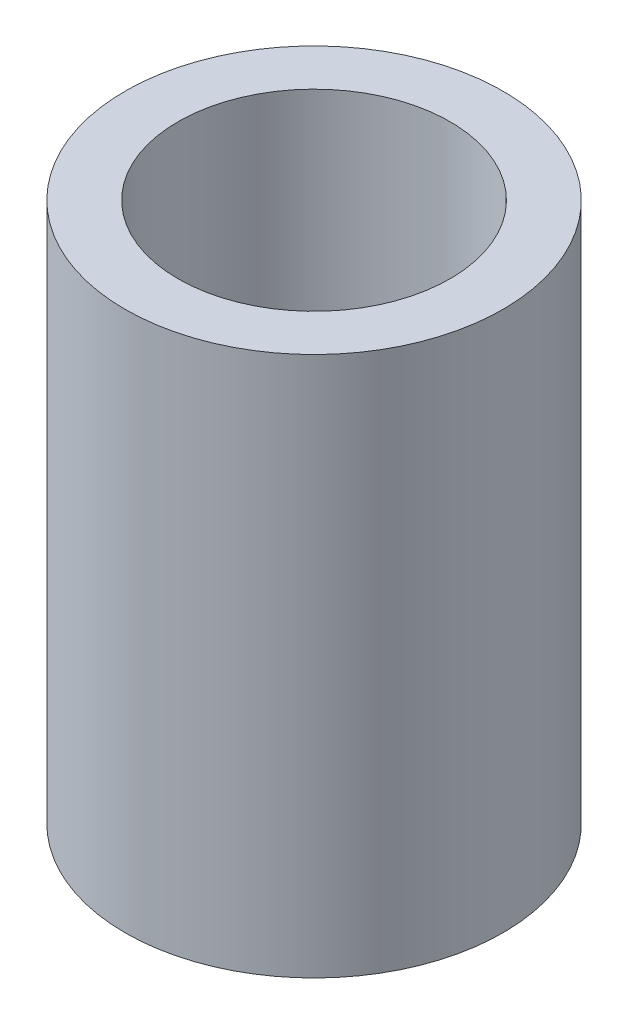
ISO-10303-21;
HEADER;
FILE_DESCRIPTION(('STEP AP214'),'2;1');
FILE_NAME('part.step','',(''),(''),'','','');
FILE_SCHEMA(('AUTOMOTIVE_DESIGN { 1 0 10303 214 1 1 1 1 }'));
ENDSEC;
DATA;
#1=APPLICATION_CONTEXT('core data for automotive mechanical design processes');
#2=APPLICATION_PROTOCOL_DEFINITION('international standard','automotive_design',2000,#1);
#3=PRODUCT_CONTEXT('',#1,'mechanical');
#4=PRODUCT('Part','Part','',(#3));
#5=PRODUCT_RELATED_PRODUCT_CATEGORY('part','',(#4));
#6=PRODUCT_DEFINITION_FORMATION('','',#4);
#7=PRODUCT_DEFINITION_CONTEXT('part definition',#1,'design');
#8=PRODUCT_DEFINITION('design','',#6,#7);
#9=PRODUCT_DEFINITION_SHAPE('','',#8);
#10=(LENGTH_UNIT() NAMED_UNIT(*) SI_UNIT(.MILLI.,.METRE.));
#11=(NAMED_UNIT(*) PLANE_ANGLE_UNIT() SI_UNIT($,.RADIAN.));
#12=(NAMED_UNIT(*) SI_UNIT($,.STERADIAN.) SOLID_ANGLE_UNIT());
#13=UNCERTAINTY_MEASURE_WITH_UNIT(LENGTH_MEASURE(1.E-05),#10,'distance_accuracy_value','');
#14=(GEOMETRIC_REPRESENTATION_CONTEXT(3) GLOBAL_UNCERTAINTY_ASSIGNED_CONTEXT((#13)) GLOBAL_UNIT_ASSIGNED_CONTEXT((#10,
#11,#12)) REPRESENTATION_CONTEXT('',''));
#15=CARTESIAN_POINT('',(0.,0.,0.));
#16=DIRECTION('',(0.,0.,1.));
#17=DIRECTION('',(1.,0.,0.));
#18=AXIS2_PLACEMENT_3D('',#15,#16,#17);
#19=CARTESIAN_POINT('',(0.,6.35,0.));
#20=DIRECTION('',(0.,1.,0.));
#21=DIRECTION('',(0.,0.,1.));
#22=AXIS2_PLACEMENT_3D('',#19,#20,#21);
#23=PLANE('',#22);
#24=CARTESIAN_POINT('',(0.,6.35,0.));
#25=DIRECTION('',(0.,1.,0.));
#26=DIRECTION('',(0.,0.,1.));
#27=AXIS2_PLACEMENT_3D('',#24,#25,#26);
#28=CIRCLE('',#27,4.445);
#29=CARTESIAN_POINT('',(0.,6.35,4.445));
#30=VERTEX_POINT('',#29);
#31=EDGE_CURVE('E10',#30,#30,#28,.T.);
#32=ORIENTED_EDGE('',*,*,#31,.T.);
#33=EDGE_LOOP('',(#32));
#34=FACE_BOUND('',#33,.T.);
#35=CARTESIAN_POINT('',(0.,6.35,0.));
#36=DIRECTION('',(0.,1.,0.));
#37=DIRECTION('',(0.,0.,1.));
#38=AXIS2_PLACEMENT_3D('',#35,#36,#37);
#39=CIRCLE('',#38,3.2004);
#40=CARTESIAN_POINT('',(0.,6.35,3.2004));
#41=VERTEX_POINT('',#40);
#42=EDGE_CURVE('E58',#41,#41,#39,.T.);
#43=ORIENTED_EDGE('',*,*,#42,.F.);
#44=EDGE_LOOP('',(#43));
#45=FACE_BOUND('',#44,.T.);
#46=ADVANCED_FACE('F45',(#34,#45),#23,.T.);
#47=CARTESIAN_POINT('',(0.,-6.35,0.));
#48=DIRECTION('',(0.,1.,0.));
#49=DIRECTION('',(0.,0.,1.));
#50=AXIS2_PLACEMENT_3D('',#47,#48,#49);
#51=PLANE('',#50);
#52=CARTESIAN_POINT('',(0.,-6.35,0.));
#53=DIRECTION('',(0.,1.,0.));
#54=DIRECTION('',(0.,0.,1.));
#55=AXIS2_PLACEMENT_3D('',#52,#53,#54);
#56=CIRCLE('',#55,4.445);
#57=CARTESIAN_POINT('',(0.,-6.35,4.445));
#58=VERTEX_POINT('',#57);
#59=EDGE_CURVE('E49',#58,#58,#56,.T.);
#60=ORIENTED_EDGE('',*,*,#59,.F.);
#61=EDGE_LOOP('',(#60));
#62=FACE_BOUND('',#61,.T.);
#63=CARTESIAN_POINT('',(0.,-6.35,0.));
#64=DIRECTION('',(0.,1.,0.));
#65=DIRECTION('',(0.,0.,1.));
#66=AXIS2_PLACEMENT_3D('',#63,#64,#65);
#67=CIRCLE('',#66,3.2004);
#68=CARTESIAN_POINT('',(0.,-6.35,3.2004));
#69=VERTEX_POINT('',#68);
#70=EDGE_CURVE('E60',#69,#69,#67,.T.);
#71=ORIENTED_EDGE('',*,*,#70,.T.);
#72=EDGE_LOOP('',(#71));
#73=FACE_BOUND('',#72,.T.);
#74=ADVANCED_FACE('F72',(#62,#73),#51,.F.);
#75=CARTESIAN_POINT('',(0.,6.35,0.));
#76=DIRECTION('',(0.,-1.,0.));
#77=DIRECTION('',(0.,0.,-1.));
#78=AXIS2_PLACEMENT_3D('',#75,#76,#77);
#79=CYLINDRICAL_SURFACE('',#78,4.445);
#80=ORIENTED_EDGE('',*,*,#31,.F.);
#81=EDGE_LOOP('',(#80));
#82=FACE_BOUND('',#81,.T.);
#83=ORIENTED_EDGE('',*,*,#59,.T.);
#84=EDGE_LOOP('',(#83));
#85=FACE_BOUND('',#84,.T.);
#86=ADVANCED_FACE('F47',(#82,#85),#79,.T.);
#87=CARTESIAN_POINT('',(0.,6.35,0.));
#88=DIRECTION('',(0.,-1.,0.));
#89=DIRECTION('',(0.,0.,-1.));
#90=AXIS2_PLACEMENT_3D('',#87,#88,#89);
#91=CYLINDRICAL_SURFACE('',#90,3.2004);
#92=ORIENTED_EDGE('',*,*,#42,.T.);
#93=EDGE_LOOP('',(#92));
#94=FACE_BOUND('',#93,.T.);
#95=ORIENTED_EDGE('',*,*,#70,.F.);
#96=EDGE_LOOP('',(#95));
#97=FACE_BOUND('',#96,.T.);
#98=ADVANCED_FACE('F68',(#94,#97),#91,.F.);
#99=CLOSED_SHELL('',(#46,#74,#86,#98));
#100=MANIFOLD_SOLID_BREP('B2',#99);
#101=ADVANCED_BREP_SHAPE_REPRESENTATION('',(#18,#100),#14);
#102=SHAPE_DEFINITION_REPRESENTATION(#9,#101);
ENDSEC;
END-ISO-10303-21;
